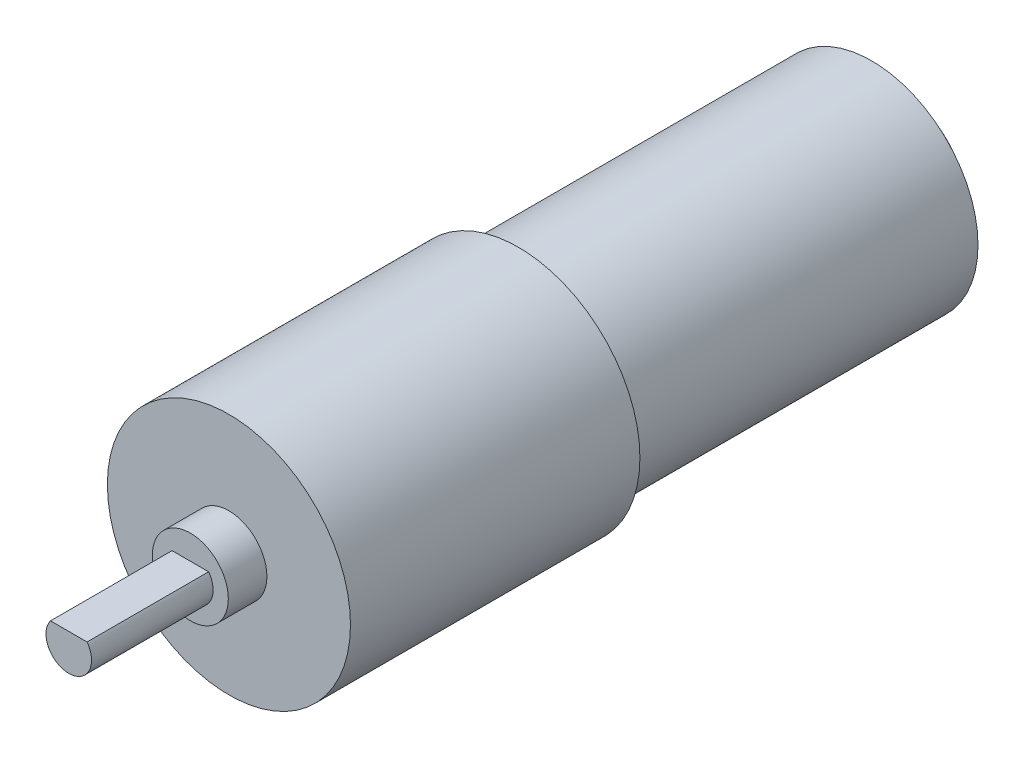
ISO-10303-21;
HEADER;
FILE_DESCRIPTION(('STEP AP214'),'2;1');
FILE_NAME('part.step','',(''),(''),'','','');
FILE_SCHEMA(('AUTOMOTIVE_DESIGN { 1 0 10303 214 1 1 1 1 }'));
ENDSEC;
DATA;
#1=APPLICATION_CONTEXT('core data for automotive mechanical design processes');
#2=APPLICATION_PROTOCOL_DEFINITION('international standard','automotive_design',2000,#1);
#3=PRODUCT_CONTEXT('',#1,'mechanical');
#4=PRODUCT('Part','Part','',(#3));
#5=PRODUCT_RELATED_PRODUCT_CATEGORY('part','',(#4));
#6=PRODUCT_DEFINITION_FORMATION('','',#4);
#7=PRODUCT_DEFINITION_CONTEXT('part definition',#1,'design');
#8=PRODUCT_DEFINITION('design','',#6,#7);
#9=PRODUCT_DEFINITION_SHAPE('','',#8);
#10=(LENGTH_UNIT() NAMED_UNIT(*) SI_UNIT(.MILLI.,.METRE.));
#11=(NAMED_UNIT(*) PLANE_ANGLE_UNIT() SI_UNIT($,.RADIAN.));
#12=(NAMED_UNIT(*) SI_UNIT($,.STERADIAN.) SOLID_ANGLE_UNIT());
#13=UNCERTAINTY_MEASURE_WITH_UNIT(LENGTH_MEASURE(1.E-05),#10,'distance_accuracy_value','');
#14=(GEOMETRIC_REPRESENTATION_CONTEXT(3) GLOBAL_UNCERTAINTY_ASSIGNED_CONTEXT((#13)) GLOBAL_UNIT_ASSIGNED_CONTEXT((#10,
#11,#12)) REPRESENTATION_CONTEXT('',''));
#15=CARTESIAN_POINT('',(0.,0.,0.));
#16=DIRECTION('',(0.,0.,1.));
#17=DIRECTION('',(1.,0.,0.));
#18=AXIS2_PLACEMENT_3D('',#15,#16,#17);
#19=CARTESIAN_POINT('',(0.,0.,-42.3));
#20=DIRECTION('',(0.,0.,-1.));
#21=DIRECTION('',(-1.,0.,0.));
#22=AXIS2_PLACEMENT_3D('',#19,#20,#21);
#23=PLANE('',#22);
#24=CARTESIAN_POINT('',(0.,0.,-42.3));
#25=DIRECTION('',(0.,0.,-1.));
#26=DIRECTION('',(-1.,0.,0.));
#27=AXIS2_PLACEMENT_3D('',#24,#25,#26);
#28=CIRCLE('',#27,7.);
#29=CARTESIAN_POINT('',(7.,0.,-42.3));
#30=VERTEX_POINT('',#29);
#31=EDGE_CURVE('E91',#30,#30,#28,.T.);
#32=ORIENTED_EDGE('',*,*,#31,.T.);
#33=EDGE_LOOP('',(#32));
#34=FACE_BOUND('',#33,.T.);
#35=DIRECTION('',(0.,1.,0.));
#36=VECTOR('',#35,1.);
#37=CARTESIAN_POINT('',(-3.2,2.70482901492867,-42.3));
#38=LINE('',#37,#36);
#39=CARTESIAN_POINT('',(-3.2,-2.70482901492867,-42.3));
#40=VERTEX_POINT('',#39);
#41=CARTESIAN_POINT('',(-3.2,2.70482901492867,-42.3));
#42=VERTEX_POINT('',#41);
#43=EDGE_CURVE('E88',#40,#42,#38,.T.);
#44=ORIENTED_EDGE('',*,*,#43,.F.);
#45=CARTESIAN_POINT('',(0.,0.,-42.3));
#46=DIRECTION('',(0.,0.,-1.));
#47=DIRECTION('',(-1.,0.,0.));
#48=AXIS2_PLACEMENT_3D('',#45,#46,#47);
#49=CIRCLE('',#48,4.19);
#50=EDGE_CURVE('E50',#42,#40,#49,.T.);
#51=ORIENTED_EDGE('',*,*,#50,.F.);
#52=EDGE_LOOP('',(#44,#51));
#53=FACE_BOUND('',#52,.T.);
#54=ADVANCED_FACE('F35',(#34,#53),#23,.T.);
#55=CARTESIAN_POINT('',(0.,0.,-19.05));
#56=DIRECTION('',(0.,0.,1.));
#57=DIRECTION('',(1.,0.,0.));
#58=AXIS2_PLACEMENT_3D('',#55,#56,#57);
#59=PLANE('',#58);
#60=CARTESIAN_POINT('',(0.,0.,-19.05));
#61=DIRECTION('',(0.,0.,1.));
#62=DIRECTION('',(1.,0.,0.));
#63=AXIS2_PLACEMENT_3D('',#60,#61,#62);
#64=CIRCLE('',#63,8.);
#65=CARTESIAN_POINT('',(8.,0.,-19.05));
#66=VERTEX_POINT('',#65);
#67=EDGE_CURVE('E118',#66,#66,#64,.T.);
#68=ORIENTED_EDGE('',*,*,#67,.F.);
#69=EDGE_LOOP('',(#68));
#70=FACE_BOUND('',#69,.T.);
#71=CARTESIAN_POINT('',(0.,0.,-19.05));
#72=DIRECTION('',(0.,0.,1.));
#73=DIRECTION('',(1.,0.,0.));
#74=AXIS2_PLACEMENT_3D('',#71,#72,#73);
#75=CIRCLE('',#74,7.);
#76=CARTESIAN_POINT('',(7.,0.,-19.05));
#77=VERTEX_POINT('',#76);
#78=EDGE_CURVE('E11',#77,#77,#75,.F.);
#79=ORIENTED_EDGE('',*,*,#78,.F.);
#80=EDGE_LOOP('',(#79));
#81=FACE_BOUND('',#80,.T.);
#82=ADVANCED_FACE('F140',(#70,#81),#59,.F.);
#83=CARTESIAN_POINT('',(0.,0.,2.54));
#84=DIRECTION('',(0.,0.,1.));
#85=DIRECTION('',(1.,0.,0.));
#86=AXIS2_PLACEMENT_3D('',#83,#84,#85);
#87=PLANE('',#86);
#88=CARTESIAN_POINT('',(0.,0.,2.54));
#89=DIRECTION('',(0.,0.,1.));
#90=DIRECTION('',(1.,0.,0.));
#91=AXIS2_PLACEMENT_3D('',#88,#89,#90);
#92=CIRCLE('',#91,1.5);
#93=CARTESIAN_POINT('',(-1.20375460595033,0.89497198204936,2.54));
#94=VERTEX_POINT('',#93);
#95=CARTESIAN_POINT('',(1.20375460595033,0.89497198204936,2.54));
#96=VERTEX_POINT('',#95);
#97=EDGE_CURVE('E105',#94,#96,#92,.T.);
#98=ORIENTED_EDGE('',*,*,#97,.F.);
#99=DIRECTION('',(1.,0.,0.));
#100=VECTOR('',#99,1.);
#101=CARTESIAN_POINT('',(-2.33431470700646,0.89497198204936,2.54));
#102=LINE('',#101,#100);
#103=EDGE_CURVE('E94',#94,#96,#102,.T.);
#104=ORIENTED_EDGE('',*,*,#103,.T.);
#105=EDGE_LOOP('',(#98,#104));
#106=FACE_BOUND('',#105,.T.);
#107=CARTESIAN_POINT('',(0.,0.,2.54));
#108=DIRECTION('',(0.,0.,1.));
#109=DIRECTION('',(1.,0.,0.));
#110=AXIS2_PLACEMENT_3D('',#107,#108,#109);
#111=CIRCLE('',#110,2.5);
#112=CARTESIAN_POINT('',(2.5,0.,2.54));
#113=VERTEX_POINT('',#112);
#114=EDGE_CURVE('E112',#113,#113,#111,.T.);
#115=ORIENTED_EDGE('',*,*,#114,.T.);
#116=EDGE_LOOP('',(#115));
#117=FACE_BOUND('',#116,.T.);
#118=ADVANCED_FACE('F146',(#106,#117),#87,.T.);
#119=CARTESIAN_POINT('',(0.,0.,0.));
#120=DIRECTION('',(0.,0.,1.));
#121=DIRECTION('',(1.,0.,0.));
#122=AXIS2_PLACEMENT_3D('',#119,#120,#121);
#123=PLANE('',#122);
#124=CARTESIAN_POINT('',(0.,0.,0.));
#125=DIRECTION('',(0.,0.,1.));
#126=DIRECTION('',(1.,0.,0.));
#127=AXIS2_PLACEMENT_3D('',#124,#125,#126);
#128=CIRCLE('',#127,8.);
#129=CARTESIAN_POINT('',(8.,0.,0.));
#130=VERTEX_POINT('',#129);
#131=EDGE_CURVE('E115',#130,#130,#128,.T.);
#132=ORIENTED_EDGE('',*,*,#131,.T.);
#133=EDGE_LOOP('',(#132));
#134=FACE_BOUND('',#133,.T.);
#135=CARTESIAN_POINT('',(0.,0.,0.));
#136=DIRECTION('',(0.,0.,1.));
#137=DIRECTION('',(1.,0.,0.));
#138=AXIS2_PLACEMENT_3D('',#135,#136,#137);
#139=CIRCLE('',#138,2.5);
#140=CARTESIAN_POINT('',(2.5,0.,0.));
#141=VERTEX_POINT('',#140);
#142=EDGE_CURVE('E109',#141,#141,#139,.T.);
#143=ORIENTED_EDGE('',*,*,#142,.F.);
#144=EDGE_LOOP('',(#143));
#145=FACE_BOUND('',#144,.T.);
#146=ADVANCED_FACE('F230',(#134,#145),#123,.T.);
#147=CARTESIAN_POINT('',(0.,0.,-19.05));
#148=DIRECTION('',(0.,0.,1.));
#149=DIRECTION('',(1.,0.,0.));
#150=AXIS2_PLACEMENT_3D('',#147,#148,#149);
#151=CYLINDRICAL_SURFACE('',#150,8.);
#152=ORIENTED_EDGE('',*,*,#67,.T.);
#153=EDGE_LOOP('',(#152));
#154=FACE_BOUND('',#153,.T.);
#155=ORIENTED_EDGE('',*,*,#131,.F.);
#156=EDGE_LOOP('',(#155));
#157=FACE_BOUND('',#156,.T.);
#158=ADVANCED_FACE('F37',(#154,#157),#151,.T.);
#159=CARTESIAN_POINT('',(0.,0.,2.54));
#160=DIRECTION('',(0.,0.,-1.));
#161=DIRECTION('',(-1.,0.,0.));
#162=AXIS2_PLACEMENT_3D('',#159,#160,#161);
#163=CYLINDRICAL_SURFACE('',#162,2.5);
#164=ORIENTED_EDGE('',*,*,#114,.F.);
#165=EDGE_LOOP('',(#164));
#166=FACE_BOUND('',#165,.T.);
#167=ORIENTED_EDGE('',*,*,#142,.T.);
#168=EDGE_LOOP('',(#167));
#169=FACE_BOUND('',#168,.T.);
#170=ADVANCED_FACE('F137',(#166,#169),#163,.T.);
#171=CARTESIAN_POINT('',(0.,0.,10.54));
#172=DIRECTION('',(0.,0.,-1.));
#173=DIRECTION('',(-1.,0.,0.));
#174=AXIS2_PLACEMENT_3D('',#171,#172,#173);
#175=CYLINDRICAL_SURFACE('',#174,1.5);
#176=CARTESIAN_POINT('',(0.,0.,10.54));
#177=DIRECTION('',(0.,0.,1.));
#178=DIRECTION('',(1.,0.,0.));
#179=AXIS2_PLACEMENT_3D('',#176,#177,#178);
#180=CIRCLE('',#179,1.5);
#181=CARTESIAN_POINT('',(-1.20375460595033,0.89497198204936,10.54));
#182=VERTEX_POINT('',#181);
#183=CARTESIAN_POINT('',(1.20375460595033,0.89497198204936,10.54));
#184=VERTEX_POINT('',#183);
#185=EDGE_CURVE('E106',#182,#184,#180,.T.);
#186=ORIENTED_EDGE('',*,*,#185,.F.);
#187=DIRECTION('',(0.,0.,-1.));
#188=VECTOR('',#187,1.);
#189=CARTESIAN_POINT('',(-1.20375460595033,0.89497198204936,10.54));
#190=LINE('',#189,#188);
#191=EDGE_CURVE('E58',#182,#94,#190,.T.);
#192=ORIENTED_EDGE('',*,*,#191,.T.);
#193=ORIENTED_EDGE('',*,*,#97,.T.);
#194=DIRECTION('',(0.,0.,-1.));
#195=VECTOR('',#194,1.);
#196=CARTESIAN_POINT('',(1.20375460595033,0.89497198204936,10.54));
#197=LINE('',#196,#195);
#198=EDGE_CURVE('E101',#96,#184,#197,.F.);
#199=ORIENTED_EDGE('',*,*,#198,.T.);
#200=EDGE_LOOP('',(#186,#192,#193,#199));
#201=FACE_BOUND('',#200,.T.);
#202=ADVANCED_FACE('F126',(#201),#175,.T.);
#203=CARTESIAN_POINT('',(0.,0.,10.54));
#204=DIRECTION('',(0.,0.,1.));
#205=DIRECTION('',(1.,0.,0.));
#206=AXIS2_PLACEMENT_3D('',#203,#204,#205);
#207=PLANE('',#206);
#208=DIRECTION('',(1.,0.,0.));
#209=VECTOR('',#208,1.);
#210=CARTESIAN_POINT('',(0.,0.89497198204936,10.54));
#211=LINE('',#210,#209);
#212=EDGE_CURVE('E43',#182,#184,#211,.T.);
#213=ORIENTED_EDGE('',*,*,#212,.F.);
#214=ORIENTED_EDGE('',*,*,#185,.T.);
#215=EDGE_LOOP('',(#213,#214));
#216=FACE_BOUND('',#215,.T.);
#217=ADVANCED_FACE('F128',(#216),#207,.T.);
#218=CARTESIAN_POINT('',(-2.33431470700646,0.89497198204936,2.54));
#219=DIRECTION('',(0.,-1.,0.));
#220=DIRECTION('',(0.,0.,-1.));
#221=AXIS2_PLACEMENT_3D('',#218,#219,#220);
#222=PLANE('',#221);
#223=ORIENTED_EDGE('',*,*,#212,.T.);
#224=ORIENTED_EDGE('',*,*,#198,.F.);
#225=ORIENTED_EDGE('',*,*,#103,.F.);
#226=ORIENTED_EDGE('',*,*,#191,.F.);
#227=EDGE_LOOP('',(#223,#224,#225,#226));
#228=FACE_BOUND('',#227,.T.);
#229=ADVANCED_FACE('F122',(#228),#222,.F.);
#230=CARTESIAN_POINT('',(0.,0.,-42.3));
#231=DIRECTION('',(0.,0.,1.));
#232=DIRECTION('',(1.,0.,0.));
#233=AXIS2_PLACEMENT_3D('',#230,#231,#232);
#234=CYLINDRICAL_SURFACE('',#233,7.);
#235=CARTESIAN_POINT('',(7.,0.,-42.3));
#236=CARTESIAN_POINT('',(7.,0.,-42.0578125));
#237=CARTESIAN_POINT('',(7.,0.,-41.815625));
#238=CARTESIAN_POINT('',(7.,0.,-41.33125));
#239=CARTESIAN_POINT('',(7.,0.,-41.0890625));
#240=CARTESIAN_POINT('',(7.,0.,-40.6046875));
#241=CARTESIAN_POINT('',(7.,0.,-40.3625));
#242=CARTESIAN_POINT('',(7.,0.,-39.878125));
#243=CARTESIAN_POINT('',(7.,0.,-39.6359375));
#244=CARTESIAN_POINT('',(7.,0.,-39.1515625));
#245=CARTESIAN_POINT('',(7.,0.,-38.909375));
#246=CARTESIAN_POINT('',(7.,0.,-38.425));
#247=CARTESIAN_POINT('',(7.,0.,-38.1828125));
#248=CARTESIAN_POINT('',(7.,0.,-37.6984375));
#249=CARTESIAN_POINT('',(7.,0.,-37.45625));
#250=CARTESIAN_POINT('',(7.,0.,-36.971875));
#251=CARTESIAN_POINT('',(7.,0.,-36.7296875));
#252=CARTESIAN_POINT('',(7.,0.,-36.2453125));
#253=CARTESIAN_POINT('',(7.,0.,-36.003125));
#254=CARTESIAN_POINT('',(7.,0.,-35.51875));
#255=CARTESIAN_POINT('',(7.,0.,-35.2765625));
#256=CARTESIAN_POINT('',(7.,0.,-34.7921875));
#257=CARTESIAN_POINT('',(7.,0.,-34.55));
#258=CARTESIAN_POINT('',(7.,0.,-34.065625));
#259=CARTESIAN_POINT('',(7.,0.,-33.8234375));
#260=CARTESIAN_POINT('',(7.,0.,-33.3390625));
#261=CARTESIAN_POINT('',(7.,0.,-33.096875));
#262=CARTESIAN_POINT('',(7.,0.,-32.6125));
#263=CARTESIAN_POINT('',(7.,0.,-32.3703125));
#264=CARTESIAN_POINT('',(7.,0.,-31.8859375));
#265=CARTESIAN_POINT('',(7.,0.,-31.64375));
#266=CARTESIAN_POINT('',(7.,0.,-31.159375));
#267=CARTESIAN_POINT('',(7.,0.,-30.9171875));
#268=CARTESIAN_POINT('',(7.,0.,-30.4328125));
#269=CARTESIAN_POINT('',(7.,0.,-30.190625));
#270=CARTESIAN_POINT('',(7.,0.,-29.70625));
#271=CARTESIAN_POINT('',(7.,0.,-29.4640625));
#272=CARTESIAN_POINT('',(7.,0.,-28.9796875));
#273=CARTESIAN_POINT('',(7.,0.,-28.7375));
#274=CARTESIAN_POINT('',(7.,0.,-28.253125));
#275=CARTESIAN_POINT('',(7.,0.,-28.0109375));
#276=CARTESIAN_POINT('',(7.,0.,-27.5265625));
#277=CARTESIAN_POINT('',(7.,0.,-27.284375));
#278=CARTESIAN_POINT('',(7.,0.,-26.8));
#279=CARTESIAN_POINT('',(7.,0.,-26.5578125));
#280=CARTESIAN_POINT('',(7.,0.,-26.0734375));
#281=CARTESIAN_POINT('',(7.,0.,-25.83125));
#282=CARTESIAN_POINT('',(7.,0.,-25.346875));
#283=CARTESIAN_POINT('',(7.,0.,-25.1046875));
#284=CARTESIAN_POINT('',(7.,0.,-24.6203125));
#285=CARTESIAN_POINT('',(7.,0.,-24.378125));
#286=CARTESIAN_POINT('',(7.,0.,-23.89375));
#287=CARTESIAN_POINT('',(7.,0.,-23.6515625));
#288=CARTESIAN_POINT('',(7.,0.,-23.1671875));
#289=CARTESIAN_POINT('',(7.,0.,-22.925));
#290=CARTESIAN_POINT('',(7.,0.,-22.440625));
#291=CARTESIAN_POINT('',(7.,0.,-22.1984375));
#292=CARTESIAN_POINT('',(7.,0.,-21.7140625));
#293=CARTESIAN_POINT('',(7.,0.,-21.471875));
#294=CARTESIAN_POINT('',(7.,0.,-20.9875));
#295=CARTESIAN_POINT('',(7.,0.,-20.7453125));
#296=CARTESIAN_POINT('',(7.,0.,-20.2609375));
#297=CARTESIAN_POINT('',(7.,0.,-20.01875));
#298=CARTESIAN_POINT('',(7.,0.,-19.534375));
#299=CARTESIAN_POINT('',(7.,0.,-19.2921875));
#300=CARTESIAN_POINT('',(7.,0.,-19.05));
#301=B_SPLINE_CURVE_WITH_KNOTS('',3,(#235,#236,#237,#238,#239,#240,#241,#242,#243,#244,#245,
#246,#247,#248,#249,#250,#251,#252,#253,#254,#255,#256,#257,#258,#259,#260,#261,#262,#263,#264,
#265,#266,#267,#268,#269,#270,#271,#272,#273,#274,#275,#276,#277,#278,#279,#280,#281,#282,#283,
#284,#285,#286,#287,#288,#289,#290,#291,#292,#293,#294,#295,#296,#297,#298,#299,#300),
.UNSPECIFIED.,.F.,.F.,(4,2,2,2,2,2,2,2,2,2,2,2,2,2,2,2,2,2,2,2,2,2,2,2,2,2,2,2,2,2,2,2,4),(0.,
0.726562500000007,1.45312500000001,2.17968750000001,2.90625000000001,3.63281250000001,
4.35937500000001,5.08593750000001,5.81250000000001,6.53906250000001,7.265625,7.9921875,8.71875,
9.4453125,10.171875,10.8984375,11.625,12.3515625,13.078125,13.8046875,14.53125,15.2578125,
15.984375,16.7109375,17.4375,18.1640625,18.890625,19.6171875,20.34375,21.0703125,21.796875,
22.5234375,23.25),.UNSPECIFIED.);
#302=EDGE_CURVE('BSEAM135',#30,#77,#301,.T.);
#303=ORIENTED_EDGE('',*,*,#31,.F.);
#304=ORIENTED_EDGE('',*,*,#78,.T.);
#305=ORIENTED_EDGE('',*,*,#302,.T.);
#306=ORIENTED_EDGE('',*,*,#302,.F.);
#307=EDGE_LOOP('',(#303,#305,#304,#306));
#308=FACE_BOUND('',#307,.T.);
#309=ADVANCED_FACE('F135',(#308),#234,.T.);
#310=CARTESIAN_POINT('',(0.,0.,-44.3));
#311=DIRECTION('',(0.,0.,1.));
#312=DIRECTION('',(1.,0.,0.));
#313=AXIS2_PLACEMENT_3D('',#310,#311,#312);
#314=CYLINDRICAL_SURFACE('',#313,4.19);
#315=ORIENTED_EDGE('',*,*,#50,.T.);
#316=DIRECTION('',(0.,0.,1.));
#317=VECTOR('',#316,1.);
#318=CARTESIAN_POINT('',(-3.2,-2.70482901492867,-44.3));
#319=LINE('',#318,#317);
#320=CARTESIAN_POINT('',(-3.2,-2.70482901492867,-44.3));
#321=VERTEX_POINT('',#320);
#322=EDGE_CURVE('E80',#321,#40,#319,.T.);
#323=ORIENTED_EDGE('',*,*,#322,.F.);
#324=CARTESIAN_POINT('',(0.,0.,-44.3));
#325=DIRECTION('',(0.,0.,-1.));
#326=DIRECTION('',(-1.,0.,0.));
#327=AXIS2_PLACEMENT_3D('',#324,#325,#326);
#328=CIRCLE('',#327,4.19);
#329=CARTESIAN_POINT('',(-3.2,2.70482901492867,-44.3));
#330=VERTEX_POINT('',#329);
#331=EDGE_CURVE('E85',#330,#321,#328,.T.);
#332=ORIENTED_EDGE('',*,*,#331,.F.);
#333=DIRECTION('',(0.,0.,1.));
#334=VECTOR('',#333,1.);
#335=CARTESIAN_POINT('',(-3.2,2.70482901492867,-44.3));
#336=LINE('',#335,#334);
#337=EDGE_CURVE('E82',#330,#42,#336,.T.);
#338=ORIENTED_EDGE('',*,*,#337,.T.);
#339=EDGE_LOOP('',(#315,#323,#332,#338));
#340=FACE_BOUND('',#339,.T.);
#341=ADVANCED_FACE('F90',(#340),#314,.T.);
#342=CARTESIAN_POINT('',(-3.2,2.70482901492867,-44.3));
#343=DIRECTION('',(1.,0.,0.));
#344=DIRECTION('',(0.,1.,0.));
#345=AXIS2_PLACEMENT_3D('',#342,#343,#344);
#346=PLANE('',#345);
#347=ORIENTED_EDGE('',*,*,#43,.T.);
#348=ORIENTED_EDGE('',*,*,#337,.F.);
#349=DIRECTION('',(0.,1.,0.));
#350=VECTOR('',#349,1.);
#351=CARTESIAN_POINT('',(-3.2,2.70482901492867,-44.3));
#352=LINE('',#351,#350);
#353=EDGE_CURVE('E77',#321,#330,#352,.T.);
#354=ORIENTED_EDGE('',*,*,#353,.F.);
#355=ORIENTED_EDGE('',*,*,#322,.T.);
#356=EDGE_LOOP('',(#347,#348,#354,#355));
#357=FACE_BOUND('',#356,.T.);
#358=ADVANCED_FACE('F79',(#357),#346,.F.);
#359=CARTESIAN_POINT('',(0.,0.,-44.3));
#360=DIRECTION('',(0.,0.,-1.));
#361=DIRECTION('',(-1.,0.,0.));
#362=AXIS2_PLACEMENT_3D('',#359,#360,#361);
#363=PLANE('',#362);
#364=ORIENTED_EDGE('',*,*,#331,.T.);
#365=ORIENTED_EDGE('',*,*,#353,.T.);
#366=EDGE_LOOP('',(#364,#365));
#367=FACE_BOUND('',#366,.T.);
#368=ADVANCED_FACE('F87',(#367),#363,.T.);
#369=CLOSED_SHELL('',(#54,#82,#118,#146,#158,#170,#202,#217,#229,#309,#341,#358,#368));
#370=MANIFOLD_SOLID_BREP('B2',#369);
#371=ADVANCED_BREP_SHAPE_REPRESENTATION('',(#18,#370),#14);
#372=SHAPE_DEFINITION_REPRESENTATION(#9,#371);
ENDSEC;
END-ISO-10303-21;
